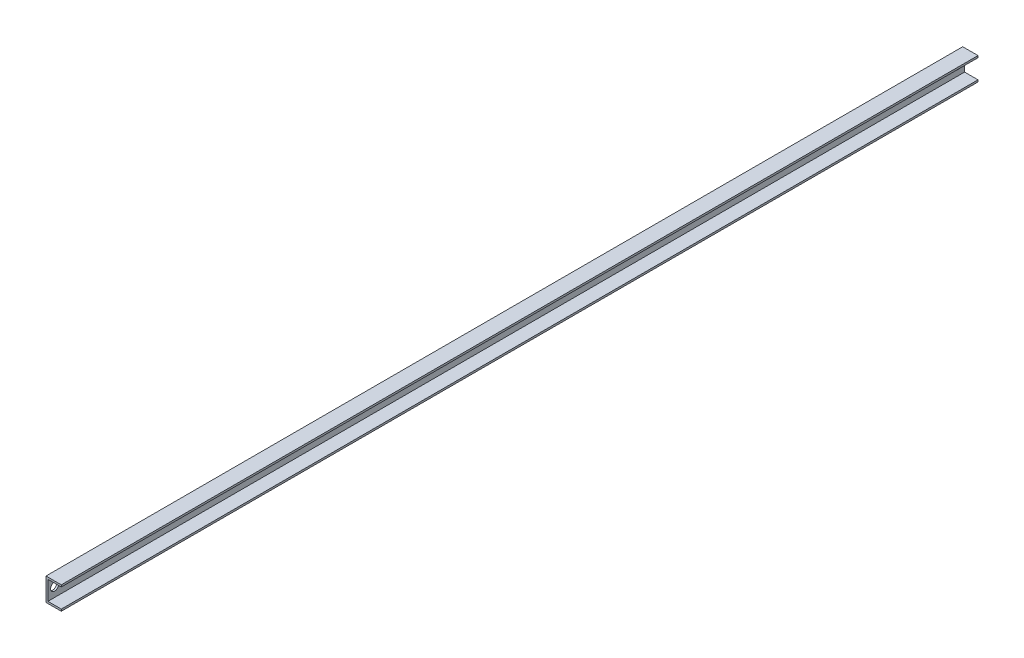
ISO-10303-21;
HEADER;
FILE_DESCRIPTION(('STEP AP214'),'2;1');
FILE_NAME('part.step','',(''),(''),'','','');
FILE_SCHEMA(('AUTOMOTIVE_DESIGN { 1 0 10303 214 1 1 1 1 }'));
ENDSEC;
DATA;
#1=APPLICATION_CONTEXT('core data for automotive mechanical design processes');
#2=APPLICATION_PROTOCOL_DEFINITION('international standard','automotive_design',2000,#1);
#3=PRODUCT_CONTEXT('',#1,'mechanical');
#4=PRODUCT('Part','Part','',(#3));
#5=PRODUCT_RELATED_PRODUCT_CATEGORY('part','',(#4));
#6=PRODUCT_DEFINITION_FORMATION('','',#4);
#7=PRODUCT_DEFINITION_CONTEXT('part definition',#1,'design');
#8=PRODUCT_DEFINITION('design','',#6,#7);
#9=PRODUCT_DEFINITION_SHAPE('','',#8);
#10=(LENGTH_UNIT() NAMED_UNIT(*) SI_UNIT(.MILLI.,.METRE.));
#11=(NAMED_UNIT(*) PLANE_ANGLE_UNIT() SI_UNIT($,.RADIAN.));
#12=(NAMED_UNIT(*) SI_UNIT($,.STERADIAN.) SOLID_ANGLE_UNIT());
#13=UNCERTAINTY_MEASURE_WITH_UNIT(LENGTH_MEASURE(1.E-05),#10,'distance_accuracy_value','');
#14=(GEOMETRIC_REPRESENTATION_CONTEXT(3) GLOBAL_UNCERTAINTY_ASSIGNED_CONTEXT((#13)) GLOBAL_UNIT_ASSIGNED_CONTEXT((#10,
#11,#12)) REPRESENTATION_CONTEXT('',''));
#15=CARTESIAN_POINT('',(0.,0.,0.));
#16=DIRECTION('',(0.,0.,1.));
#17=DIRECTION('',(1.,0.,0.));
#18=AXIS2_PLACEMENT_3D('',#15,#16,#17);
#19=CARTESIAN_POINT('',(0.,19.05,762.));
#20=DIRECTION('',(1.,0.,0.));
#21=DIRECTION('',(0.,1.,0.));
#22=AXIS2_PLACEMENT_3D('',#19,#20,#21);
#23=PLANE('',#22);
#24=CARTESIAN_POINT('',(0.,9.525,5.58800000000004));
#25=DIRECTION('',(-1.,0.,0.));
#26=DIRECTION('',(0.,0.,1.));
#27=AXIS2_PLACEMENT_3D('',#24,#25,#26);
#28=CIRCLE('',#27,3.373501);
#29=CARTESIAN_POINT('',(0.,9.525,8.96150100000004));
#30=VERTEX_POINT('',#29);
#31=EDGE_CURVE('E174',#30,#30,#28,.T.);
#32=ORIENTED_EDGE('',*,*,#31,.F.);
#33=EDGE_LOOP('',(#32));
#34=FACE_BOUND('',#33,.T.);
#35=CARTESIAN_POINT('',(0.,9.525,45.212));
#36=DIRECTION('',(-1.,0.,0.));
#37=DIRECTION('',(0.,0.,1.));
#38=AXIS2_PLACEMENT_3D('',#35,#36,#37);
#39=CIRCLE('',#38,3.373501);
#40=CARTESIAN_POINT('',(0.,9.525,48.585501));
#41=VERTEX_POINT('',#40);
#42=EDGE_CURVE('E164',#41,#41,#39,.T.);
#43=ORIENTED_EDGE('',*,*,#42,.F.);
#44=EDGE_LOOP('',(#43));
#45=FACE_BOUND('',#44,.T.);
#46=CARTESIAN_POINT('',(0.,9.525,716.787));
#47=DIRECTION('',(-1.,0.,0.));
#48=DIRECTION('',(0.,0.,1.));
#49=AXIS2_PLACEMENT_3D('',#46,#47,#48);
#50=CIRCLE('',#49,3.373501);
#51=CARTESIAN_POINT('',(0.,9.525,720.160501));
#52=VERTEX_POINT('',#51);
#53=EDGE_CURVE('E161',#52,#52,#50,.T.);
#54=ORIENTED_EDGE('',*,*,#53,.F.);
#55=EDGE_LOOP('',(#54));
#56=FACE_BOUND('',#55,.T.);
#57=CARTESIAN_POINT('',(0.,9.525,756.412));
#58=DIRECTION('',(-1.,0.,0.));
#59=DIRECTION('',(0.,0.,1.));
#60=AXIS2_PLACEMENT_3D('',#57,#58,#59);
#61=CIRCLE('',#60,3.373501);
#62=CARTESIAN_POINT('',(0.,9.525,759.785501));
#63=VERTEX_POINT('',#62);
#64=EDGE_CURVE('E158',#63,#63,#61,.T.);
#65=ORIENTED_EDGE('',*,*,#64,.F.);
#66=EDGE_LOOP('',(#65));
#67=FACE_BOUND('',#66,.T.);
#68=DIRECTION('',(0.,-1.,0.));
#69=VECTOR('',#68,1.);
#70=CARTESIAN_POINT('',(0.,19.05,0.));
#71=LINE('',#70,#69);
#72=CARTESIAN_POINT('',(0.,19.05,0.));
#73=VERTEX_POINT('',#72);
#74=CARTESIAN_POINT('',(0.,0.,0.));
#75=VERTEX_POINT('',#74);
#76=EDGE_CURVE('E129',#73,#75,#71,.T.);
#77=ORIENTED_EDGE('',*,*,#76,.T.);
#78=DIRECTION('',(0.,0.,-1.));
#79=VECTOR('',#78,1.);
#80=CARTESIAN_POINT('',(0.,0.,762.));
#81=LINE('',#80,#79);
#82=CARTESIAN_POINT('',(0.,0.,762.));
#83=VERTEX_POINT('',#82);
#84=EDGE_CURVE('E11',#83,#75,#81,.T.);
#85=ORIENTED_EDGE('',*,*,#84,.F.);
#86=DIRECTION('',(0.,-1.,0.));
#87=VECTOR('',#86,1.);
#88=CARTESIAN_POINT('',(0.,19.05,762.));
#89=LINE('',#88,#87);
#90=CARTESIAN_POINT('',(0.,19.05,762.));
#91=VERTEX_POINT('',#90);
#92=EDGE_CURVE('E144',#91,#83,#89,.T.);
#93=ORIENTED_EDGE('',*,*,#92,.F.);
#94=DIRECTION('',(0.,0.,-1.));
#95=VECTOR('',#94,1.);
#96=CARTESIAN_POINT('',(0.,19.05,762.));
#97=LINE('',#96,#95);
#98=EDGE_CURVE('E125',#91,#73,#97,.T.);
#99=ORIENTED_EDGE('',*,*,#98,.T.);
#100=EDGE_LOOP('',(#77,#85,#93,#99));
#101=FACE_BOUND('',#100,.T.);
#102=ADVANCED_FACE('F31',(#34,#45,#56,#67,#101),#23,.F.);
#103=CARTESIAN_POINT('',(0.,0.,762.));
#104=DIRECTION('',(0.,1.,0.));
#105=DIRECTION('',(0.,0.,1.));
#106=AXIS2_PLACEMENT_3D('',#103,#104,#105);
#107=PLANE('',#106);
#108=DIRECTION('',(1.,0.,0.));
#109=VECTOR('',#108,1.);
#110=CARTESIAN_POINT('',(0.,0.,0.));
#111=LINE('',#110,#109);
#112=CARTESIAN_POINT('',(12.7,0.,0.));
#113=VERTEX_POINT('',#112);
#114=EDGE_CURVE('E132',#75,#113,#111,.T.);
#115=ORIENTED_EDGE('',*,*,#114,.T.);
#116=DIRECTION('',(0.,0.,-1.));
#117=VECTOR('',#116,1.);
#118=CARTESIAN_POINT('',(12.7,0.,762.));
#119=LINE('',#118,#117);
#120=CARTESIAN_POINT('',(12.7,0.,762.));
#121=VERTEX_POINT('',#120);
#122=EDGE_CURVE('E40',#121,#113,#119,.T.);
#123=ORIENTED_EDGE('',*,*,#122,.F.);
#124=DIRECTION('',(1.,0.,0.));
#125=VECTOR('',#124,1.);
#126=CARTESIAN_POINT('',(0.,0.,762.));
#127=LINE('',#126,#125);
#128=EDGE_CURVE('E92',#83,#121,#127,.T.);
#129=ORIENTED_EDGE('',*,*,#128,.F.);
#130=ORIENTED_EDGE('',*,*,#84,.T.);
#131=EDGE_LOOP('',(#115,#123,#129,#130));
#132=FACE_BOUND('',#131,.T.);
#133=ADVANCED_FACE('F212',(#132),#107,.F.);
#134=CARTESIAN_POINT('',(12.7,0.,762.));
#135=DIRECTION('',(-1.,0.,0.));
#136=DIRECTION('',(0.,0.,1.));
#137=AXIS2_PLACEMENT_3D('',#134,#135,#136);
#138=PLANE('',#137);
#139=DIRECTION('',(0.,1.,0.));
#140=VECTOR('',#139,1.);
#141=CARTESIAN_POINT('',(12.7,0.,0.));
#142=LINE('',#141,#140);
#143=CARTESIAN_POINT('',(12.7,1.5875,0.));
#144=VERTEX_POINT('',#143);
#145=EDGE_CURVE('E135',#113,#144,#142,.T.);
#146=ORIENTED_EDGE('',*,*,#145,.T.);
#147=DIRECTION('',(0.,0.,-1.));
#148=VECTOR('',#147,1.);
#149=CARTESIAN_POINT('',(12.7,1.5875,762.));
#150=LINE('',#149,#148);
#151=CARTESIAN_POINT('',(12.7,1.5875,762.));
#152=VERTEX_POINT('',#151);
#153=EDGE_CURVE('E151',#152,#144,#150,.T.);
#154=ORIENTED_EDGE('',*,*,#153,.F.);
#155=DIRECTION('',(0.,1.,0.));
#156=VECTOR('',#155,1.);
#157=CARTESIAN_POINT('',(12.7,0.,762.));
#158=LINE('',#157,#156);
#159=EDGE_CURVE('E181',#121,#152,#158,.T.);
#160=ORIENTED_EDGE('',*,*,#159,.F.);
#161=ORIENTED_EDGE('',*,*,#122,.T.);
#162=EDGE_LOOP('',(#146,#154,#160,#161));
#163=FACE_BOUND('',#162,.T.);
#164=ADVANCED_FACE('F217',(#163),#138,.F.);
#165=CARTESIAN_POINT('',(12.7,1.5875,762.));
#166=DIRECTION('',(0.,-1.,0.));
#167=DIRECTION('',(1.,0.,0.));
#168=AXIS2_PLACEMENT_3D('',#165,#166,#167);
#169=PLANE('',#168);
#170=DIRECTION('',(-1.,0.,0.));
#171=VECTOR('',#170,1.);
#172=CARTESIAN_POINT('',(12.7,1.5875,0.));
#173=LINE('',#172,#171);
#174=CARTESIAN_POINT('',(1.5875,1.5875,0.));
#175=VERTEX_POINT('',#174);
#176=EDGE_CURVE('E137',#144,#175,#173,.T.);
#177=ORIENTED_EDGE('',*,*,#176,.T.);
#178=DIRECTION('',(0.,0.,-1.));
#179=VECTOR('',#178,1.);
#180=CARTESIAN_POINT('',(1.5875,1.5875,762.));
#181=LINE('',#180,#179);
#182=CARTESIAN_POINT('',(1.5875,1.5875,762.));
#183=VERTEX_POINT('',#182);
#184=EDGE_CURVE('E148',#183,#175,#181,.T.);
#185=ORIENTED_EDGE('',*,*,#184,.F.);
#186=DIRECTION('',(-1.,0.,0.));
#187=VECTOR('',#186,1.);
#188=CARTESIAN_POINT('',(12.7,1.5875,762.));
#189=LINE('',#188,#187);
#190=EDGE_CURVE('E183',#152,#183,#189,.T.);
#191=ORIENTED_EDGE('',*,*,#190,.F.);
#192=ORIENTED_EDGE('',*,*,#153,.T.);
#193=EDGE_LOOP('',(#177,#185,#191,#192));
#194=FACE_BOUND('',#193,.T.);
#195=ADVANCED_FACE('F189',(#194),#169,.F.);
#196=CARTESIAN_POINT('',(1.5875,17.4625,762.));
#197=DIRECTION('',(-1.,0.,0.));
#198=DIRECTION('',(0.,-1.,0.));
#199=AXIS2_PLACEMENT_3D('',#196,#197,#198);
#200=PLANE('',#199);
#201=CARTESIAN_POINT('',(1.5875,9.525,5.58800000000004));
#202=DIRECTION('',(-1.,0.,0.));
#203=DIRECTION('',(0.,-1.,0.));
#204=AXIS2_PLACEMENT_3D('',#201,#202,#203);
#205=CIRCLE('',#204,3.373501);
#206=CARTESIAN_POINT('',(1.5875,6.151499,5.58800000000004));
#207=VERTEX_POINT('',#206);
#208=EDGE_CURVE('E34',#207,#207,#205,.T.);
#209=ORIENTED_EDGE('',*,*,#208,.T.);
#210=EDGE_LOOP('',(#209));
#211=FACE_BOUND('',#210,.T.);
#212=CARTESIAN_POINT('',(1.5875,9.525,45.212));
#213=DIRECTION('',(-1.,0.,0.));
#214=DIRECTION('',(0.,-1.,0.));
#215=AXIS2_PLACEMENT_3D('',#212,#213,#214);
#216=CIRCLE('',#215,3.373501);
#217=CARTESIAN_POINT('',(1.5875,6.151499,45.212));
#218=VERTEX_POINT('',#217);
#219=EDGE_CURVE('E162',#218,#218,#216,.T.);
#220=ORIENTED_EDGE('',*,*,#219,.T.);
#221=EDGE_LOOP('',(#220));
#222=FACE_BOUND('',#221,.T.);
#223=CARTESIAN_POINT('',(1.5875,9.525,716.787));
#224=DIRECTION('',(-1.,0.,0.));
#225=DIRECTION('',(0.,-1.,0.));
#226=AXIS2_PLACEMENT_3D('',#223,#224,#225);
#227=CIRCLE('',#226,3.373501);
#228=CARTESIAN_POINT('',(1.5875,6.151499,716.787));
#229=VERTEX_POINT('',#228);
#230=EDGE_CURVE('E159',#229,#229,#227,.T.);
#231=ORIENTED_EDGE('',*,*,#230,.T.);
#232=EDGE_LOOP('',(#231));
#233=FACE_BOUND('',#232,.T.);
#234=CARTESIAN_POINT('',(1.5875,9.525,756.412));
#235=DIRECTION('',(-1.,0.,0.));
#236=DIRECTION('',(0.,-1.,0.));
#237=AXIS2_PLACEMENT_3D('',#234,#235,#236);
#238=CIRCLE('',#237,3.373501);
#239=CARTESIAN_POINT('',(1.5875,6.151499,756.412));
#240=VERTEX_POINT('',#239);
#241=EDGE_CURVE('E133',#240,#240,#238,.T.);
#242=ORIENTED_EDGE('',*,*,#241,.T.);
#243=EDGE_LOOP('',(#242));
#244=FACE_BOUND('',#243,.T.);
#245=DIRECTION('',(0.,1.,0.));
#246=VECTOR('',#245,1.);
#247=CARTESIAN_POINT('',(1.5875,17.4625,0.));
#248=LINE('',#247,#246);
#249=CARTESIAN_POINT('',(1.5875,17.4625,0.));
#250=VERTEX_POINT('',#249);
#251=EDGE_CURVE('E139',#175,#250,#248,.T.);
#252=ORIENTED_EDGE('',*,*,#251,.T.);
#253=DIRECTION('',(0.,0.,-1.));
#254=VECTOR('',#253,1.);
#255=CARTESIAN_POINT('',(1.5875,17.4625,762.));
#256=LINE('',#255,#254);
#257=CARTESIAN_POINT('',(1.5875,17.4625,762.));
#258=VERTEX_POINT('',#257);
#259=EDGE_CURVE('E120',#258,#250,#256,.T.);
#260=ORIENTED_EDGE('',*,*,#259,.F.);
#261=DIRECTION('',(0.,1.,0.));
#262=VECTOR('',#261,1.);
#263=CARTESIAN_POINT('',(1.5875,17.4625,762.));
#264=LINE('',#263,#262);
#265=EDGE_CURVE('E111',#183,#258,#264,.T.);
#266=ORIENTED_EDGE('',*,*,#265,.F.);
#267=ORIENTED_EDGE('',*,*,#184,.T.);
#268=EDGE_LOOP('',(#252,#260,#266,#267));
#269=FACE_BOUND('',#268,.T.);
#270=ADVANCED_FACE('F193',(#211,#222,#233,#244,#269),#200,.F.);
#271=CARTESIAN_POINT('',(12.7,17.4625,762.));
#272=DIRECTION('',(0.,1.,0.));
#273=DIRECTION('',(0.,0.,1.));
#274=AXIS2_PLACEMENT_3D('',#271,#272,#273);
#275=PLANE('',#274);
#276=DIRECTION('',(1.,0.,0.));
#277=VECTOR('',#276,1.);
#278=CARTESIAN_POINT('',(12.7,17.4625,0.));
#279=LINE('',#278,#277);
#280=CARTESIAN_POINT('',(12.7,17.4625,0.));
#281=VERTEX_POINT('',#280);
#282=EDGE_CURVE('E119',#250,#281,#279,.T.);
#283=ORIENTED_EDGE('',*,*,#282,.T.);
#284=DIRECTION('',(0.,0.,-1.));
#285=VECTOR('',#284,1.);
#286=CARTESIAN_POINT('',(12.7,17.4625,762.));
#287=LINE('',#286,#285);
#288=CARTESIAN_POINT('',(12.7,17.4625,762.));
#289=VERTEX_POINT('',#288);
#290=EDGE_CURVE('E116',#289,#281,#287,.T.);
#291=ORIENTED_EDGE('',*,*,#290,.F.);
#292=DIRECTION('',(1.,0.,0.));
#293=VECTOR('',#292,1.);
#294=CARTESIAN_POINT('',(12.7,17.4625,762.));
#295=LINE('',#294,#293);
#296=EDGE_CURVE('E105',#258,#289,#295,.T.);
#297=ORIENTED_EDGE('',*,*,#296,.F.);
#298=ORIENTED_EDGE('',*,*,#259,.T.);
#299=EDGE_LOOP('',(#283,#291,#297,#298));
#300=FACE_BOUND('',#299,.T.);
#301=ADVANCED_FACE('F117',(#300),#275,.F.);
#302=CARTESIAN_POINT('',(12.7,19.05,762.));
#303=DIRECTION('',(-1.,0.,0.));
#304=DIRECTION('',(0.,0.,1.));
#305=AXIS2_PLACEMENT_3D('',#302,#303,#304);
#306=PLANE('',#305);
#307=DIRECTION('',(0.,1.,0.));
#308=VECTOR('',#307,1.);
#309=CARTESIAN_POINT('',(12.7,19.05,0.));
#310=LINE('',#309,#308);
#311=CARTESIAN_POINT('',(12.7,19.05,0.));
#312=VERTEX_POINT('',#311);
#313=EDGE_CURVE('E78',#281,#312,#310,.T.);
#314=ORIENTED_EDGE('',*,*,#313,.T.);
#315=DIRECTION('',(0.,0.,-1.));
#316=VECTOR('',#315,1.);
#317=CARTESIAN_POINT('',(12.7,19.05,762.));
#318=LINE('',#317,#316);
#319=CARTESIAN_POINT('',(12.7,19.05,762.));
#320=VERTEX_POINT('',#319);
#321=EDGE_CURVE('E121',#320,#312,#318,.T.);
#322=ORIENTED_EDGE('',*,*,#321,.F.);
#323=DIRECTION('',(0.,1.,0.));
#324=VECTOR('',#323,1.);
#325=CARTESIAN_POINT('',(12.7,19.05,762.));
#326=LINE('',#325,#324);
#327=EDGE_CURVE('E109',#289,#320,#326,.T.);
#328=ORIENTED_EDGE('',*,*,#327,.F.);
#329=ORIENTED_EDGE('',*,*,#290,.T.);
#330=EDGE_LOOP('',(#314,#322,#328,#329));
#331=FACE_BOUND('',#330,.T.);
#332=ADVANCED_FACE('F123',(#331),#306,.F.);
#333=CARTESIAN_POINT('',(0.,19.05,762.));
#334=DIRECTION('',(0.,-1.,0.));
#335=DIRECTION('',(0.,0.,-1.));
#336=AXIS2_PLACEMENT_3D('',#333,#334,#335);
#337=PLANE('',#336);
#338=DIRECTION('',(-1.,0.,0.));
#339=VECTOR('',#338,1.);
#340=CARTESIAN_POINT('',(0.,19.05,0.));
#341=LINE('',#340,#339);
#342=EDGE_CURVE('E84',#312,#73,#341,.T.);
#343=ORIENTED_EDGE('',*,*,#342,.T.);
#344=ORIENTED_EDGE('',*,*,#98,.F.);
#345=DIRECTION('',(-1.,0.,0.));
#346=VECTOR('',#345,1.);
#347=CARTESIAN_POINT('',(0.,19.05,762.));
#348=LINE('',#347,#346);
#349=EDGE_CURVE('E49',#320,#91,#348,.T.);
#350=ORIENTED_EDGE('',*,*,#349,.F.);
#351=ORIENTED_EDGE('',*,*,#321,.T.);
#352=EDGE_LOOP('',(#343,#344,#350,#351));
#353=FACE_BOUND('',#352,.T.);
#354=ADVANCED_FACE('F201',(#353),#337,.F.);
#355=CARTESIAN_POINT('',(0.,0.,762.));
#356=DIRECTION('',(0.,0.,1.));
#357=DIRECTION('',(1.,0.,0.));
#358=AXIS2_PLACEMENT_3D('',#355,#356,#357);
#359=PLANE('',#358);
#360=ORIENTED_EDGE('',*,*,#92,.T.);
#361=ORIENTED_EDGE('',*,*,#128,.T.);
#362=ORIENTED_EDGE('',*,*,#159,.T.);
#363=ORIENTED_EDGE('',*,*,#190,.T.);
#364=ORIENTED_EDGE('',*,*,#265,.T.);
#365=ORIENTED_EDGE('',*,*,#296,.T.);
#366=ORIENTED_EDGE('',*,*,#327,.T.);
#367=ORIENTED_EDGE('',*,*,#349,.T.);
#368=EDGE_LOOP('',(#360,#361,#362,#363,#364,#365,#366,#367));
#369=FACE_BOUND('',#368,.T.);
#370=ADVANCED_FACE('F107',(#369),#359,.T.);
#371=CARTESIAN_POINT('',(0.,0.,0.));
#372=DIRECTION('',(0.,0.,1.));
#373=DIRECTION('',(1.,0.,0.));
#374=AXIS2_PLACEMENT_3D('',#371,#372,#373);
#375=PLANE('',#374);
#376=ORIENTED_EDGE('',*,*,#76,.F.);
#377=ORIENTED_EDGE('',*,*,#342,.F.);
#378=ORIENTED_EDGE('',*,*,#313,.F.);
#379=ORIENTED_EDGE('',*,*,#282,.F.);
#380=ORIENTED_EDGE('',*,*,#251,.F.);
#381=ORIENTED_EDGE('',*,*,#176,.F.);
#382=ORIENTED_EDGE('',*,*,#145,.F.);
#383=ORIENTED_EDGE('',*,*,#114,.F.);
#384=EDGE_LOOP('',(#376,#377,#378,#379,#380,#381,#382,#383));
#385=FACE_BOUND('',#384,.T.);
#386=ADVANCED_FACE('F196',(#385),#375,.F.);
#387=CARTESIAN_POINT('',(0.,9.525,756.412));
#388=DIRECTION('',(-1.,0.,0.));
#389=DIRECTION('',(0.,0.,1.));
#390=AXIS2_PLACEMENT_3D('',#387,#388,#389);
#391=CYLINDRICAL_SURFACE('',#390,3.373501);
#392=ORIENTED_EDGE('',*,*,#64,.T.);
#393=EDGE_LOOP('',(#392));
#394=FACE_BOUND('',#393,.T.);
#395=ORIENTED_EDGE('',*,*,#241,.F.);
#396=EDGE_LOOP('',(#395));
#397=FACE_BOUND('',#396,.T.);
#398=ADVANCED_FACE('F226',(#394,#397),#391,.F.);
#399=CARTESIAN_POINT('',(0.,9.525,716.787));
#400=DIRECTION('',(-1.,0.,0.));
#401=DIRECTION('',(0.,0.,1.));
#402=AXIS2_PLACEMENT_3D('',#399,#400,#401);
#403=CYLINDRICAL_SURFACE('',#402,3.373501);
#404=ORIENTED_EDGE('',*,*,#53,.T.);
#405=EDGE_LOOP('',(#404));
#406=FACE_BOUND('',#405,.T.);
#407=ORIENTED_EDGE('',*,*,#230,.F.);
#408=EDGE_LOOP('',(#407));
#409=FACE_BOUND('',#408,.T.);
#410=ADVANCED_FACE('F229',(#406,#409),#403,.F.);
#411=CARTESIAN_POINT('',(0.,9.525,45.212));
#412=DIRECTION('',(-1.,0.,0.));
#413=DIRECTION('',(0.,0.,1.));
#414=AXIS2_PLACEMENT_3D('',#411,#412,#413);
#415=CYLINDRICAL_SURFACE('',#414,3.373501);
#416=ORIENTED_EDGE('',*,*,#42,.T.);
#417=EDGE_LOOP('',(#416));
#418=FACE_BOUND('',#417,.T.);
#419=ORIENTED_EDGE('',*,*,#219,.F.);
#420=EDGE_LOOP('',(#419));
#421=FACE_BOUND('',#420,.T.);
#422=ADVANCED_FACE('F306',(#418,#421),#415,.F.);
#423=CARTESIAN_POINT('',(0.,9.525,5.58800000000004));
#424=DIRECTION('',(-1.,0.,0.));
#425=DIRECTION('',(0.,0.,1.));
#426=AXIS2_PLACEMENT_3D('',#423,#424,#425);
#427=CYLINDRICAL_SURFACE('',#426,3.373501);
#428=ORIENTED_EDGE('',*,*,#31,.T.);
#429=EDGE_LOOP('',(#428));
#430=FACE_BOUND('',#429,.T.);
#431=ORIENTED_EDGE('',*,*,#208,.F.);
#432=EDGE_LOOP('',(#431));
#433=FACE_BOUND('',#432,.T.);
#434=ADVANCED_FACE('F316',(#430,#433),#427,.F.);
#435=CLOSED_SHELL('',(#102,#133,#164,#195,#270,#301,#332,#354,#370,#386,#398,#410,#422,#434));
#436=MANIFOLD_SOLID_BREP('B2',#435);
#437=ADVANCED_BREP_SHAPE_REPRESENTATION('',(#18,#436),#14);
#438=SHAPE_DEFINITION_REPRESENTATION(#9,#437);
ENDSEC;
END-ISO-10303-21;
